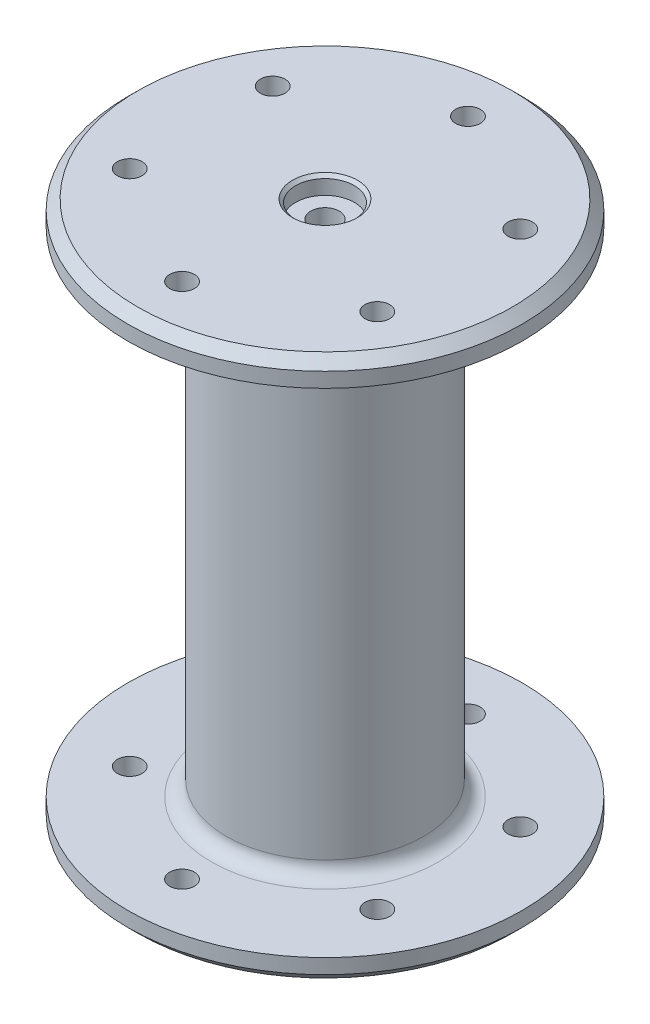
ISO-10303-21;
HEADER;
FILE_DESCRIPTION(('STEP AP214'),'2;1');
FILE_NAME('part.step','',(''),(''),'','','');
FILE_SCHEMA(('AUTOMOTIVE_DESIGN { 1 0 10303 214 1 1 1 1 }'));
ENDSEC;
DATA;
#1=APPLICATION_CONTEXT('core data for automotive mechanical design processes');
#2=APPLICATION_PROTOCOL_DEFINITION('international standard','automotive_design',2000,#1);
#3=PRODUCT_CONTEXT('',#1,'mechanical');
#4=PRODUCT('Part','Part','',(#3));
#5=PRODUCT_RELATED_PRODUCT_CATEGORY('part','',(#4));
#6=PRODUCT_DEFINITION_FORMATION('','',#4);
#7=PRODUCT_DEFINITION_CONTEXT('part definition',#1,'design');
#8=PRODUCT_DEFINITION('design','',#6,#7);
#9=PRODUCT_DEFINITION_SHAPE('','',#8);
#10=(LENGTH_UNIT() NAMED_UNIT(*) SI_UNIT(.MILLI.,.METRE.));
#11=(NAMED_UNIT(*) PLANE_ANGLE_UNIT() SI_UNIT($,.RADIAN.));
#12=(NAMED_UNIT(*) SI_UNIT($,.STERADIAN.) SOLID_ANGLE_UNIT());
#13=UNCERTAINTY_MEASURE_WITH_UNIT(LENGTH_MEASURE(1.E-05),#10,'distance_accuracy_value','');
#14=(GEOMETRIC_REPRESENTATION_CONTEXT(3) GLOBAL_UNCERTAINTY_ASSIGNED_CONTEXT((#13)) GLOBAL_UNIT_ASSIGNED_CONTEXT((#10,
#11,#12)) REPRESENTATION_CONTEXT('',''));
#15=CARTESIAN_POINT('',(0.,0.,0.));
#16=DIRECTION('',(0.,0.,1.));
#17=DIRECTION('',(1.,0.,0.));
#18=AXIS2_PLACEMENT_3D('',#15,#16,#17);
#19=CARTESIAN_POINT('',(0.,50.,0.));
#20=DIRECTION('',(0.,-1.,0.));
#21=DIRECTION('',(0.,0.,-1.));
#22=AXIS2_PLACEMENT_3D('',#19,#20,#21);
#23=CYLINDRICAL_SURFACE('',#22,20.);
#24=CARTESIAN_POINT('',(0.,-47.,0.));
#25=DIRECTION('',(0.,-1.,0.));
#26=DIRECTION('',(0.,0.,-1.));
#27=AXIS2_PLACEMENT_3D('',#24,#25,#26);
#28=CIRCLE('',#27,20.);
#29=CARTESIAN_POINT('',(0.,-47.,-20.));
#30=VERTEX_POINT('',#29);
#31=EDGE_CURVE('E45',#30,#30,#28,.F.);
#32=ORIENTED_EDGE('',*,*,#31,.T.);
#33=EDGE_LOOP('',(#32));
#34=FACE_BOUND('',#33,.T.);
#35=CARTESIAN_POINT('',(0.,47.,0.));
#36=DIRECTION('',(0.,1.,0.));
#37=DIRECTION('',(0.,0.,1.));
#38=AXIS2_PLACEMENT_3D('',#35,#36,#37);
#39=CIRCLE('',#38,20.);
#40=CARTESIAN_POINT('',(0.,47.,20.));
#41=VERTEX_POINT('',#40);
#42=EDGE_CURVE('E61',#41,#41,#39,.F.);
#43=ORIENTED_EDGE('',*,*,#42,.T.);
#44=EDGE_LOOP('',(#43));
#45=FACE_BOUND('',#44,.T.);
#46=ADVANCED_FACE('F37',(#34,#45),#23,.T.);
#47=CARTESIAN_POINT('',(0.,55.,0.));
#48=DIRECTION('',(0.,-1.,0.));
#49=DIRECTION('',(0.,0.,-1.));
#50=AXIS2_PLACEMENT_3D('',#47,#48,#49);
#51=CYLINDRICAL_SURFACE('',#50,40.);
#52=CARTESIAN_POINT('',(0.,53.,0.));
#53=DIRECTION('',(0.,1.,0.));
#54=DIRECTION('',(0.,0.,1.));
#55=AXIS2_PLACEMENT_3D('',#52,#53,#54);
#56=CIRCLE('',#55,40.);
#57=CARTESIAN_POINT('',(0.,53.,40.));
#58=VERTEX_POINT('',#57);
#59=EDGE_CURVE('E69',#58,#58,#56,.F.);
#60=ORIENTED_EDGE('',*,*,#59,.T.);
#61=EDGE_LOOP('',(#60));
#62=FACE_BOUND('',#61,.T.);
#63=CARTESIAN_POINT('',(0.,50.,0.));
#64=DIRECTION('',(0.,1.,0.));
#65=DIRECTION('',(0.,0.,1.));
#66=AXIS2_PLACEMENT_3D('',#63,#64,#65);
#67=CIRCLE('',#66,40.);
#68=CARTESIAN_POINT('',(0.,50.,40.));
#69=VERTEX_POINT('',#68);
#70=EDGE_CURVE('E96',#69,#69,#67,.T.);
#71=ORIENTED_EDGE('',*,*,#70,.T.);
#72=EDGE_LOOP('',(#71));
#73=FACE_BOUND('',#72,.T.);
#74=ADVANCED_FACE('F258',(#62,#73),#51,.T.);
#75=CARTESIAN_POINT('',(0.,55.,0.));
#76=DIRECTION('',(0.,1.,0.));
#77=DIRECTION('',(0.,0.,1.));
#78=AXIS2_PLACEMENT_3D('',#75,#76,#77);
#79=PLANE('',#78);
#80=CARTESIAN_POINT('',(0.,55.,0.));
#81=DIRECTION('',(0.,1.,0.));
#82=DIRECTION('',(0.,0.,1.));
#83=AXIS2_PLACEMENT_3D('',#80,#81,#82);
#84=CIRCLE('',#83,6.58876);
#85=CARTESIAN_POINT('',(0.,55.,6.58876));
#86=VERTEX_POINT('',#85);
#87=EDGE_CURVE('E141',#86,#86,#84,.T.);
#88=ORIENTED_EDGE('',*,*,#87,.F.);
#89=EDGE_LOOP('',(#88));
#90=FACE_BOUND('',#89,.T.);
#91=CARTESIAN_POINT('',(25.1147367097486,55.,-14.5000000000003));
#92=DIRECTION('',(0.,1.,0.));
#93=DIRECTION('',(-0.866025403784433,0.,0.50000000000001));
#94=AXIS2_PLACEMENT_3D('',#91,#92,#93);
#95=CIRCLE('',#94,2.5);
#96=CARTESIAN_POINT('',(22.9496732002875,55.,-13.2500000000003));
#97=VERTEX_POINT('',#96);
#98=EDGE_CURVE('E114',#97,#97,#95,.T.);
#99=ORIENTED_EDGE('',*,*,#98,.F.);
#100=EDGE_LOOP('',(#99));
#101=FACE_BOUND('',#100,.T.);
#102=CARTESIAN_POINT('',(25.1147367097489,55.,14.4999999999998));
#103=DIRECTION('',(0.,1.,0.));
#104=DIRECTION('',(-0.866025403784443,0.,-0.499999999999992));
#105=AXIS2_PLACEMENT_3D('',#102,#103,#104);
#106=CIRCLE('',#105,2.5);
#107=CARTESIAN_POINT('',(22.9496732002877,55.,13.2499999999998));
#108=VERTEX_POINT('',#107);
#109=EDGE_CURVE('E118',#108,#108,#106,.T.);
#110=ORIENTED_EDGE('',*,*,#109,.F.);
#111=EDGE_LOOP('',(#110));
#112=FACE_BOUND('',#111,.T.);
#113=CARTESIAN_POINT('',(0.,55.,29.));
#114=DIRECTION('',(0.,1.,0.));
#115=DIRECTION('',(0.,0.,-1.));
#116=AXIS2_PLACEMENT_3D('',#113,#114,#115);
#117=CIRCLE('',#116,2.5);
#118=CARTESIAN_POINT('',(0.,55.,26.5));
#119=VERTEX_POINT('',#118);
#120=EDGE_CURVE('E123',#119,#119,#117,.T.);
#121=ORIENTED_EDGE('',*,*,#120,.F.);
#122=EDGE_LOOP('',(#121));
#123=FACE_BOUND('',#122,.T.);
#124=CARTESIAN_POINT('',(-25.1147367097487,55.,14.5000000000001));
#125=DIRECTION('',(0.,1.,0.));
#126=DIRECTION('',(0.866025403784436,0.,-0.500000000000004));
#127=AXIS2_PLACEMENT_3D('',#124,#125,#126);
#128=CIRCLE('',#127,2.5);
#129=CARTESIAN_POINT('',(-22.9496732002876,55.,13.2500000000001));
#130=VERTEX_POINT('',#129);
#131=EDGE_CURVE('E113',#130,#130,#128,.T.);
#132=ORIENTED_EDGE('',*,*,#131,.F.);
#133=EDGE_LOOP('',(#132));
#134=FACE_BOUND('',#133,.T.);
#135=CARTESIAN_POINT('',(-25.1147367097488,55.,-14.4999999999999));
#136=DIRECTION('',(0.,1.,0.));
#137=DIRECTION('',(0.86602540378444,0.,0.499999999999998));
#138=AXIS2_PLACEMENT_3D('',#135,#136,#137);
#139=CIRCLE('',#138,2.5);
#140=CARTESIAN_POINT('',(-22.9496732002877,55.,-13.2499999999999));
#141=VERTEX_POINT('',#140);
#142=EDGE_CURVE('E91',#141,#141,#139,.T.);
#143=ORIENTED_EDGE('',*,*,#142,.F.);
#144=EDGE_LOOP('',(#143));
#145=FACE_BOUND('',#144,.T.);
#146=CARTESIAN_POINT('',(0.,55.,-29.));
#147=DIRECTION('',(0.,1.,0.));
#148=DIRECTION('',(0.,0.,1.));
#149=AXIS2_PLACEMENT_3D('',#146,#147,#148);
#150=CIRCLE('',#149,2.5);
#151=CARTESIAN_POINT('',(0.,55.,-26.5));
#152=VERTEX_POINT('',#151);
#153=EDGE_CURVE('E74',#152,#152,#150,.T.);
#154=ORIENTED_EDGE('',*,*,#153,.F.);
#155=EDGE_LOOP('',(#154));
#156=FACE_BOUND('',#155,.T.);
#157=CARTESIAN_POINT('',(0.,55.,0.));
#158=DIRECTION('',(0.,1.,0.));
#159=DIRECTION('',(0.,0.,1.));
#160=AXIS2_PLACEMENT_3D('',#157,#158,#159);
#161=CIRCLE('',#160,38.);
#162=CARTESIAN_POINT('',(0.,55.,38.));
#163=VERTEX_POINT('',#162);
#164=EDGE_CURVE('E100',#163,#163,#161,.T.);
#165=ORIENTED_EDGE('',*,*,#164,.T.);
#166=EDGE_LOOP('',(#165));
#167=FACE_BOUND('',#166,.T.);
#168=ADVANCED_FACE('F263',(#90,#101,#112,#123,#134,#145,#156,#167),#79,.T.);
#169=CARTESIAN_POINT('',(0.,50.,0.));
#170=DIRECTION('',(0.,1.,0.));
#171=DIRECTION('',(0.,0.,1.));
#172=AXIS2_PLACEMENT_3D('',#169,#170,#171);
#173=PLANE('',#172);
#174=CARTESIAN_POINT('',(0.,50.,0.));
#175=DIRECTION('',(0.,1.,0.));
#176=DIRECTION('',(0.,0.,1.));
#177=AXIS2_PLACEMENT_3D('',#174,#175,#176);
#178=CIRCLE('',#177,23.);
#179=CARTESIAN_POINT('',(0.,50.,23.));
#180=VERTEX_POINT('',#179);
#181=EDGE_CURVE('E65',#180,#180,#178,.T.);
#182=ORIENTED_EDGE('',*,*,#181,.T.);
#183=EDGE_LOOP('',(#182));
#184=FACE_BOUND('',#183,.T.);
#185=CARTESIAN_POINT('',(25.1147367097486,50.,-14.5000000000003));
#186=DIRECTION('',(0.,1.,0.));
#187=DIRECTION('',(0.,0.,1.));
#188=AXIS2_PLACEMENT_3D('',#185,#186,#187);
#189=CIRCLE('',#188,2.5);
#190=CARTESIAN_POINT('',(25.1147367097486,50.,-12.0000000000003));
#191=VERTEX_POINT('',#190);
#192=EDGE_CURVE('E70',#191,#191,#189,.T.);
#193=ORIENTED_EDGE('',*,*,#192,.T.);
#194=EDGE_LOOP('',(#193));
#195=FACE_BOUND('',#194,.T.);
#196=CARTESIAN_POINT('',(25.1147367097489,50.,14.4999999999998));
#197=DIRECTION('',(0.,1.,0.));
#198=DIRECTION('',(0.,0.,1.));
#199=AXIS2_PLACEMENT_3D('',#196,#197,#198);
#200=CIRCLE('',#199,2.5);
#201=CARTESIAN_POINT('',(25.1147367097489,50.,16.9999999999998));
#202=VERTEX_POINT('',#201);
#203=EDGE_CURVE('E75',#202,#202,#200,.T.);
#204=ORIENTED_EDGE('',*,*,#203,.T.);
#205=EDGE_LOOP('',(#204));
#206=FACE_BOUND('',#205,.T.);
#207=CARTESIAN_POINT('',(0.,50.,29.));
#208=DIRECTION('',(0.,1.,0.));
#209=DIRECTION('',(0.,0.,1.));
#210=AXIS2_PLACEMENT_3D('',#207,#208,#209);
#211=CIRCLE('',#210,2.5);
#212=CARTESIAN_POINT('',(0.,50.,31.5));
#213=VERTEX_POINT('',#212);
#214=EDGE_CURVE('E79',#213,#213,#211,.T.);
#215=ORIENTED_EDGE('',*,*,#214,.T.);
#216=EDGE_LOOP('',(#215));
#217=FACE_BOUND('',#216,.T.);
#218=CARTESIAN_POINT('',(-25.1147367097487,50.,14.5000000000001));
#219=DIRECTION('',(0.,1.,0.));
#220=DIRECTION('',(0.,0.,1.));
#221=AXIS2_PLACEMENT_3D('',#218,#219,#220);
#222=CIRCLE('',#221,2.5);
#223=CARTESIAN_POINT('',(-25.1147367097487,50.,17.0000000000001));
#224=VERTEX_POINT('',#223);
#225=EDGE_CURVE('E83',#224,#224,#222,.T.);
#226=ORIENTED_EDGE('',*,*,#225,.T.);
#227=EDGE_LOOP('',(#226));
#228=FACE_BOUND('',#227,.T.);
#229=CARTESIAN_POINT('',(-25.1147367097488,50.,-14.4999999999999));
#230=DIRECTION('',(0.,1.,0.));
#231=DIRECTION('',(0.,0.,1.));
#232=AXIS2_PLACEMENT_3D('',#229,#230,#231);
#233=CIRCLE('',#232,2.5);
#234=CARTESIAN_POINT('',(-25.1147367097488,50.,-11.9999999999999));
#235=VERTEX_POINT('',#234);
#236=EDGE_CURVE('E87',#235,#235,#233,.T.);
#237=ORIENTED_EDGE('',*,*,#236,.T.);
#238=EDGE_LOOP('',(#237));
#239=FACE_BOUND('',#238,.T.);
#240=CARTESIAN_POINT('',(0.,50.,-29.));
#241=DIRECTION('',(0.,1.,0.));
#242=DIRECTION('',(0.,0.,1.));
#243=AXIS2_PLACEMENT_3D('',#240,#241,#242);
#244=CIRCLE('',#243,2.5);
#245=CARTESIAN_POINT('',(0.,50.,-26.5));
#246=VERTEX_POINT('',#245);
#247=EDGE_CURVE('E92',#246,#246,#244,.T.);
#248=ORIENTED_EDGE('',*,*,#247,.T.);
#249=EDGE_LOOP('',(#248));
#250=FACE_BOUND('',#249,.T.);
#251=ORIENTED_EDGE('',*,*,#70,.F.);
#252=EDGE_LOOP('',(#251));
#253=FACE_BOUND('',#252,.T.);
#254=ADVANCED_FACE('F273',(#184,#195,#206,#217,#228,#239,#250,#253),#173,.F.);
#255=CARTESIAN_POINT('',(0.,55.,0.));
#256=DIRECTION('',(0.,-1.,0.));
#257=DIRECTION('',(0.,0.,-1.));
#258=AXIS2_PLACEMENT_3D('',#255,#256,#257);
#259=CONICAL_SURFACE('',#258,38.,0.78539816339744);
#260=ORIENTED_EDGE('',*,*,#59,.F.);
#261=EDGE_LOOP('',(#260));
#262=FACE_BOUND('',#261,.T.);
#263=ORIENTED_EDGE('',*,*,#164,.F.);
#264=EDGE_LOOP('',(#263));
#265=FACE_BOUND('',#264,.T.);
#266=ADVANCED_FACE('F269',(#262,#265),#259,.T.);
#267=CARTESIAN_POINT('',(0.,-50.,-29.));
#268=DIRECTION('',(0.,1.,0.));
#269=DIRECTION('',(0.,0.,1.));
#270=AXIS2_PLACEMENT_3D('',#267,#268,#269);
#271=CYLINDRICAL_SURFACE('',#270,2.5);
#272=ORIENTED_EDGE('',*,*,#153,.T.);
#273=EDGE_LOOP('',(#272));
#274=FACE_BOUND('',#273,.T.);
#275=ORIENTED_EDGE('',*,*,#247,.F.);
#276=EDGE_LOOP('',(#275));
#277=FACE_BOUND('',#276,.T.);
#278=ADVANCED_FACE('F272',(#274,#277),#271,.F.);
#279=CARTESIAN_POINT('',(-25.1147367097488,-50.,-14.4999999999999));
#280=DIRECTION('',(0.,1.,0.));
#281=DIRECTION('',(0.,0.,1.));
#282=AXIS2_PLACEMENT_3D('',#279,#280,#281);
#283=CYLINDRICAL_SURFACE('',#282,2.5);
#284=ORIENTED_EDGE('',*,*,#142,.T.);
#285=EDGE_LOOP('',(#284));
#286=FACE_BOUND('',#285,.T.);
#287=ORIENTED_EDGE('',*,*,#236,.F.);
#288=EDGE_LOOP('',(#287));
#289=FACE_BOUND('',#288,.T.);
#290=ADVANCED_FACE('F312',(#286,#289),#283,.F.);
#291=CARTESIAN_POINT('',(-25.1147367097487,-50.,14.5000000000001));
#292=DIRECTION('',(0.,1.,0.));
#293=DIRECTION('',(0.,0.,1.));
#294=AXIS2_PLACEMENT_3D('',#291,#292,#293);
#295=CYLINDRICAL_SURFACE('',#294,2.5);
#296=ORIENTED_EDGE('',*,*,#131,.T.);
#297=EDGE_LOOP('',(#296));
#298=FACE_BOUND('',#297,.T.);
#299=ORIENTED_EDGE('',*,*,#225,.F.);
#300=EDGE_LOOP('',(#299));
#301=FACE_BOUND('',#300,.T.);
#302=ADVANCED_FACE('F318',(#298,#301),#295,.F.);
#303=CARTESIAN_POINT('',(0.,-50.,29.));
#304=DIRECTION('',(0.,1.,0.));
#305=DIRECTION('',(0.,0.,1.));
#306=AXIS2_PLACEMENT_3D('',#303,#304,#305);
#307=CYLINDRICAL_SURFACE('',#306,2.5);
#308=ORIENTED_EDGE('',*,*,#120,.T.);
#309=EDGE_LOOP('',(#308));
#310=FACE_BOUND('',#309,.T.);
#311=ORIENTED_EDGE('',*,*,#214,.F.);
#312=EDGE_LOOP('',(#311));
#313=FACE_BOUND('',#312,.T.);
#314=ADVANCED_FACE('F346',(#310,#313),#307,.F.);
#315=CARTESIAN_POINT('',(25.1147367097489,-50.,14.4999999999998));
#316=DIRECTION('',(0.,1.,0.));
#317=DIRECTION('',(0.,0.,1.));
#318=AXIS2_PLACEMENT_3D('',#315,#316,#317);
#319=CYLINDRICAL_SURFACE('',#318,2.5);
#320=ORIENTED_EDGE('',*,*,#109,.T.);
#321=EDGE_LOOP('',(#320));
#322=FACE_BOUND('',#321,.T.);
#323=ORIENTED_EDGE('',*,*,#203,.F.);
#324=EDGE_LOOP('',(#323));
#325=FACE_BOUND('',#324,.T.);
#326=ADVANCED_FACE('F287',(#322,#325),#319,.F.);
#327=CARTESIAN_POINT('',(25.1147367097486,-50.,-14.5000000000003));
#328=DIRECTION('',(0.,1.,0.));
#329=DIRECTION('',(0.,0.,1.));
#330=AXIS2_PLACEMENT_3D('',#327,#328,#329);
#331=CYLINDRICAL_SURFACE('',#330,2.5);
#332=ORIENTED_EDGE('',*,*,#98,.T.);
#333=EDGE_LOOP('',(#332));
#334=FACE_BOUND('',#333,.T.);
#335=ORIENTED_EDGE('',*,*,#192,.F.);
#336=EDGE_LOOP('',(#335));
#337=FACE_BOUND('',#336,.T.);
#338=ADVANCED_FACE('F278',(#334,#337),#331,.F.);
#339=CARTESIAN_POINT('',(0.,47.,0.));
#340=DIRECTION('',(0.,1.,0.));
#341=DIRECTION('',(0.,0.,1.));
#342=AXIS2_PLACEMENT_3D('',#339,#340,#341);
#343=TOROIDAL_SURFACE('',#342,23.,3.);
#344=ORIENTED_EDGE('',*,*,#42,.F.);
#345=EDGE_LOOP('',(#344));
#346=FACE_BOUND('',#345,.T.);
#347=ORIENTED_EDGE('',*,*,#181,.F.);
#348=EDGE_LOOP('',(#347));
#349=FACE_BOUND('',#348,.T.);
#350=ADVANCED_FACE('F275',(#346,#349),#343,.F.);
#351=CARTESIAN_POINT('',(0.,55.,0.));
#352=DIRECTION('',(0.,1.,0.));
#353=DIRECTION('',(0.,0.,1.));
#354=AXIS2_PLACEMENT_3D('',#351,#352,#353);
#355=CYLINDRICAL_SURFACE('',#354,2.89559999999999);
#356=CARTESIAN_POINT('',(0.,51.4186,0.));
#357=DIRECTION('',(0.,1.,0.));
#358=DIRECTION('',(0.,0.,1.));
#359=AXIS2_PLACEMENT_3D('',#356,#357,#358);
#360=CIRCLE('',#359,2.8956);
#361=CARTESIAN_POINT('',(0.,51.4186,2.8956));
#362=VERTEX_POINT('',#361);
#363=EDGE_CURVE('E119',#362,#362,#360,.T.);
#364=ORIENTED_EDGE('',*,*,#363,.T.);
#365=EDGE_LOOP('',(#364));
#366=FACE_BOUND('',#365,.T.);
#367=CARTESIAN_POINT('',(0.,-51.4186,0.));
#368=DIRECTION('',(0.,-1.,0.));
#369=DIRECTION('',(0.,0.,-1.));
#370=AXIS2_PLACEMENT_3D('',#367,#368,#369);
#371=CIRCLE('',#370,2.8956);
#372=CARTESIAN_POINT('',(0.,-51.4186,-2.8956));
#373=VERTEX_POINT('',#372);
#374=EDGE_CURVE('E197',#373,#373,#371,.T.);
#375=ORIENTED_EDGE('',*,*,#374,.T.);
#376=EDGE_LOOP('',(#375));
#377=FACE_BOUND('',#376,.T.);
#378=ADVANCED_FACE('F277',(#366,#377),#355,.F.);
#379=CARTESIAN_POINT('',(5.95376,51.4186,0.));
#380=DIRECTION('',(0.,-1.,0.));
#381=DIRECTION('',(0.,0.,-1.));
#382=AXIS2_PLACEMENT_3D('',#379,#380,#381);
#383=PLANE('',#382);
#384=ORIENTED_EDGE('',*,*,#363,.F.);
#385=EDGE_LOOP('',(#384));
#386=FACE_BOUND('',#385,.T.);
#387=CARTESIAN_POINT('',(0.,51.4186,0.));
#388=DIRECTION('',(0.,1.,0.));
#389=DIRECTION('',(0.,0.,1.));
#390=AXIS2_PLACEMENT_3D('',#387,#388,#389);
#391=CIRCLE('',#390,5.95376);
#392=CARTESIAN_POINT('',(0.,51.4186,5.95376));
#393=VERTEX_POINT('',#392);
#394=EDGE_CURVE('E133',#393,#393,#391,.T.);
#395=ORIENTED_EDGE('',*,*,#394,.T.);
#396=EDGE_LOOP('',(#395));
#397=FACE_BOUND('',#396,.T.);
#398=ADVANCED_FACE('F284',(#386,#397),#383,.F.);
#399=CARTESIAN_POINT('',(0.,55.,0.));
#400=DIRECTION('',(0.,1.,0.));
#401=DIRECTION('',(0.,0.,1.));
#402=AXIS2_PLACEMENT_3D('',#399,#400,#401);
#403=CYLINDRICAL_SURFACE('',#402,5.95376);
#404=ORIENTED_EDGE('',*,*,#394,.F.);
#405=EDGE_LOOP('',(#404));
#406=FACE_BOUND('',#405,.T.);
#407=CARTESIAN_POINT('',(0.,54.365,0.));
#408=DIRECTION('',(0.,1.,0.));
#409=DIRECTION('',(0.,0.,1.));
#410=AXIS2_PLACEMENT_3D('',#407,#408,#409);
#411=CIRCLE('',#410,5.95376);
#412=CARTESIAN_POINT('',(0.,54.365,5.95376));
#413=VERTEX_POINT('',#412);
#414=EDGE_CURVE('E137',#413,#413,#411,.T.);
#415=ORIENTED_EDGE('',*,*,#414,.T.);
#416=EDGE_LOOP('',(#415));
#417=FACE_BOUND('',#416,.T.);
#418=ADVANCED_FACE('F253',(#406,#417),#403,.F.);
#419=CARTESIAN_POINT('',(0.,55.,0.));
#420=DIRECTION('',(0.,1.,0.));
#421=DIRECTION('',(0.,0.,1.));
#422=AXIS2_PLACEMENT_3D('',#419,#420,#421);
#423=CONICAL_SURFACE('',#422,6.58876,0.785398163397446);
#424=ORIENTED_EDGE('',*,*,#414,.F.);
#425=EDGE_LOOP('',(#424));
#426=FACE_BOUND('',#425,.T.);
#427=ORIENTED_EDGE('',*,*,#87,.T.);
#428=EDGE_LOOP('',(#427));
#429=FACE_BOUND('',#428,.T.);
#430=ADVANCED_FACE('F248',(#426,#429),#423,.F.);
#431=CARTESIAN_POINT('',(0.,-50.,0.));
#432=DIRECTION('',(0.,-1.,0.));
#433=DIRECTION('',(0.,0.,1.));
#434=AXIS2_PLACEMENT_3D('',#431,#432,#433);
#435=PLANE('',#434);
#436=CARTESIAN_POINT('',(0.,-50.,0.));
#437=DIRECTION('',(0.,-1.,0.));
#438=DIRECTION('',(0.,0.,-1.));
#439=AXIS2_PLACEMENT_3D('',#436,#437,#438);
#440=CIRCLE('',#439,23.);
#441=CARTESIAN_POINT('',(0.,-50.,-23.));
#442=VERTEX_POINT('',#441);
#443=EDGE_CURVE('E10',#442,#442,#440,.T.);
#444=ORIENTED_EDGE('',*,*,#443,.T.);
#445=EDGE_LOOP('',(#444));
#446=FACE_BOUND('',#445,.T.);
#447=CARTESIAN_POINT('',(25.1147367097486,-50.,-14.5000000000003));
#448=DIRECTION('',(0.,-1.,0.));
#449=DIRECTION('',(0.,0.,-1.));
#450=AXIS2_PLACEMENT_3D('',#447,#448,#449);
#451=CIRCLE('',#450,2.5);
#452=CARTESIAN_POINT('',(25.1147367097486,-50.,-17.0000000000003));
#453=VERTEX_POINT('',#452);
#454=EDGE_CURVE('E157',#453,#453,#451,.F.);
#455=ORIENTED_EDGE('',*,*,#454,.F.);
#456=EDGE_LOOP('',(#455));
#457=FACE_BOUND('',#456,.T.);
#458=CARTESIAN_POINT('',(25.1147367097489,-50.,14.4999999999998));
#459=DIRECTION('',(0.,-1.,0.));
#460=DIRECTION('',(0.,0.,-1.));
#461=AXIS2_PLACEMENT_3D('',#458,#459,#460);
#462=CIRCLE('',#461,2.5);
#463=CARTESIAN_POINT('',(25.1147367097489,-50.,11.9999999999998));
#464=VERTEX_POINT('',#463);
#465=EDGE_CURVE('E161',#464,#464,#462,.F.);
#466=ORIENTED_EDGE('',*,*,#465,.F.);
#467=EDGE_LOOP('',(#466));
#468=FACE_BOUND('',#467,.T.);
#469=CARTESIAN_POINT('',(0.,-50.,29.));
#470=DIRECTION('',(0.,-1.,0.));
#471=DIRECTION('',(0.,0.,-1.));
#472=AXIS2_PLACEMENT_3D('',#469,#470,#471);
#473=CIRCLE('',#472,2.5);
#474=CARTESIAN_POINT('',(0.,-50.,26.5));
#475=VERTEX_POINT('',#474);
#476=EDGE_CURVE('E165',#475,#475,#473,.F.);
#477=ORIENTED_EDGE('',*,*,#476,.F.);
#478=EDGE_LOOP('',(#477));
#479=FACE_BOUND('',#478,.T.);
#480=CARTESIAN_POINT('',(-25.1147367097487,-50.,14.5000000000001));
#481=DIRECTION('',(0.,-1.,0.));
#482=DIRECTION('',(0.,0.,-1.));
#483=AXIS2_PLACEMENT_3D('',#480,#481,#482);
#484=CIRCLE('',#483,2.5);
#485=CARTESIAN_POINT('',(-25.1147367097487,-50.,12.0000000000001));
#486=VERTEX_POINT('',#485);
#487=EDGE_CURVE('E169',#486,#486,#484,.F.);
#488=ORIENTED_EDGE('',*,*,#487,.F.);
#489=EDGE_LOOP('',(#488));
#490=FACE_BOUND('',#489,.T.);
#491=CARTESIAN_POINT('',(-25.1147367097488,-50.,-14.4999999999999));
#492=DIRECTION('',(0.,-1.,0.));
#493=DIRECTION('',(0.,0.,-1.));
#494=AXIS2_PLACEMENT_3D('',#491,#492,#493);
#495=CIRCLE('',#494,2.5);
#496=CARTESIAN_POINT('',(-25.1147367097488,-50.,-17.));
#497=VERTEX_POINT('',#496);
#498=EDGE_CURVE('E173',#497,#497,#495,.F.);
#499=ORIENTED_EDGE('',*,*,#498,.F.);
#500=EDGE_LOOP('',(#499));
#501=FACE_BOUND('',#500,.T.);
#502=CARTESIAN_POINT('',(0.,-50.,-29.));
#503=DIRECTION('',(0.,-1.,0.));
#504=DIRECTION('',(0.,0.,-1.));
#505=AXIS2_PLACEMENT_3D('',#502,#503,#504);
#506=CIRCLE('',#505,2.5);
#507=CARTESIAN_POINT('',(0.,-50.,-31.5));
#508=VERTEX_POINT('',#507);
#509=EDGE_CURVE('E149',#508,#508,#506,.F.);
#510=ORIENTED_EDGE('',*,*,#509,.F.);
#511=EDGE_LOOP('',(#510));
#512=FACE_BOUND('',#511,.T.);
#513=CARTESIAN_POINT('',(0.,-50.,0.));
#514=DIRECTION('',(0.,1.,0.));
#515=DIRECTION('',(0.,0.,1.));
#516=AXIS2_PLACEMENT_3D('',#513,#514,#515);
#517=CIRCLE('',#516,40.);
#518=CARTESIAN_POINT('',(0.,-50.,40.));
#519=VERTEX_POINT('',#518);
#520=EDGE_CURVE('E145',#519,#519,#517,.T.);
#521=ORIENTED_EDGE('',*,*,#520,.T.);
#522=EDGE_LOOP('',(#521));
#523=FACE_BOUND('',#522,.T.);
#524=ADVANCED_FACE('F220',(#446,#457,#468,#479,#490,#501,#512,#523),#435,.F.);
#525=CARTESIAN_POINT('',(0.,-55.,0.));
#526=DIRECTION('',(0.,-1.,0.));
#527=DIRECTION('',(0.,0.,1.));
#528=AXIS2_PLACEMENT_3D('',#525,#526,#527);
#529=PLANE('',#528);
#530=CARTESIAN_POINT('',(0.,-55.,0.));
#531=DIRECTION('',(0.,-1.,0.));
#532=DIRECTION('',(0.,0.,-1.));
#533=AXIS2_PLACEMENT_3D('',#530,#531,#532);
#534=CIRCLE('',#533,6.58876);
#535=CARTESIAN_POINT('',(0.,-55.,-6.58876));
#536=VERTEX_POINT('',#535);
#537=EDGE_CURVE('E209',#536,#536,#534,.T.);
#538=ORIENTED_EDGE('',*,*,#537,.F.);
#539=EDGE_LOOP('',(#538));
#540=FACE_BOUND('',#539,.T.);
#541=CARTESIAN_POINT('',(25.1147367097486,-55.,-14.5000000000003));
#542=DIRECTION('',(0.,1.,0.));
#543=DIRECTION('',(-0.866025403784433,0.,0.50000000000001));
#544=AXIS2_PLACEMENT_3D('',#541,#542,#543);
#545=CIRCLE('',#544,2.5);
#546=CARTESIAN_POINT('',(22.9496732002875,-55.,-13.2500000000003));
#547=VERTEX_POINT('',#546);
#548=EDGE_CURVE('E183',#547,#547,#545,.T.);
#549=ORIENTED_EDGE('',*,*,#548,.T.);
#550=EDGE_LOOP('',(#549));
#551=FACE_BOUND('',#550,.T.);
#552=CARTESIAN_POINT('',(25.1147367097489,-55.,14.4999999999998));
#553=DIRECTION('',(0.,1.,0.));
#554=DIRECTION('',(-0.866025403784443,0.,-0.499999999999992));
#555=AXIS2_PLACEMENT_3D('',#552,#553,#554);
#556=CIRCLE('',#555,2.5);
#557=CARTESIAN_POINT('',(22.9496732002877,-55.,13.2499999999998));
#558=VERTEX_POINT('',#557);
#559=EDGE_CURVE('E178',#558,#558,#556,.T.);
#560=ORIENTED_EDGE('',*,*,#559,.T.);
#561=EDGE_LOOP('',(#560));
#562=FACE_BOUND('',#561,.T.);
#563=CARTESIAN_POINT('',(0.,-55.,29.));
#564=DIRECTION('',(0.,1.,0.));
#565=DIRECTION('',(0.,0.,-1.));
#566=AXIS2_PLACEMENT_3D('',#563,#564,#565);
#567=CIRCLE('',#566,2.5);
#568=CARTESIAN_POINT('',(0.,-55.,26.5));
#569=VERTEX_POINT('',#568);
#570=EDGE_CURVE('E182',#569,#569,#567,.T.);
#571=ORIENTED_EDGE('',*,*,#570,.T.);
#572=EDGE_LOOP('',(#571));
#573=FACE_BOUND('',#572,.T.);
#574=CARTESIAN_POINT('',(-25.1147367097487,-55.,14.5000000000001));
#575=DIRECTION('',(0.,1.,0.));
#576=DIRECTION('',(0.866025403784436,0.,-0.500000000000004));
#577=AXIS2_PLACEMENT_3D('',#574,#575,#576);
#578=CIRCLE('',#577,2.5);
#579=CARTESIAN_POINT('',(-22.9496732002876,-55.,13.2500000000001));
#580=VERTEX_POINT('',#579);
#581=EDGE_CURVE('E187',#580,#580,#578,.T.);
#582=ORIENTED_EDGE('',*,*,#581,.T.);
#583=EDGE_LOOP('',(#582));
#584=FACE_BOUND('',#583,.T.);
#585=CARTESIAN_POINT('',(-25.1147367097488,-55.,-14.4999999999999));
#586=DIRECTION('',(0.,1.,0.));
#587=DIRECTION('',(0.86602540378444,0.,0.499999999999998));
#588=AXIS2_PLACEMENT_3D('',#585,#586,#587);
#589=CIRCLE('',#588,2.5);
#590=CARTESIAN_POINT('',(-22.9496732002877,-55.,-13.2499999999999));
#591=VERTEX_POINT('',#590);
#592=EDGE_CURVE('E177',#591,#591,#589,.T.);
#593=ORIENTED_EDGE('',*,*,#592,.T.);
#594=EDGE_LOOP('',(#593));
#595=FACE_BOUND('',#594,.T.);
#596=CARTESIAN_POINT('',(0.,-55.,-29.));
#597=DIRECTION('',(0.,1.,0.));
#598=DIRECTION('',(0.,0.,1.));
#599=AXIS2_PLACEMENT_3D('',#596,#597,#598);
#600=CIRCLE('',#599,2.5);
#601=CARTESIAN_POINT('',(0.,-55.,-26.5));
#602=VERTEX_POINT('',#601);
#603=EDGE_CURVE('E153',#602,#602,#600,.T.);
#604=ORIENTED_EDGE('',*,*,#603,.T.);
#605=EDGE_LOOP('',(#604));
#606=FACE_BOUND('',#605,.T.);
#607=CARTESIAN_POINT('',(0.,-55.,0.));
#608=DIRECTION('',(0.,-1.,0.));
#609=DIRECTION('',(0.,0.,-1.));
#610=AXIS2_PLACEMENT_3D('',#607,#608,#609);
#611=CIRCLE('',#610,38.);
#612=CARTESIAN_POINT('',(0.,-55.,-38.));
#613=VERTEX_POINT('',#612);
#614=EDGE_CURVE('E50',#613,#613,#611,.T.);
#615=ORIENTED_EDGE('',*,*,#614,.T.);
#616=EDGE_LOOP('',(#615));
#617=FACE_BOUND('',#616,.T.);
#618=ADVANCED_FACE('F216',(#540,#551,#562,#573,#584,#595,#606,#617),#529,.T.);
#619=CARTESIAN_POINT('',(0.,-55.,0.));
#620=DIRECTION('',(0.,1.,0.));
#621=DIRECTION('',(0.,0.,1.));
#622=AXIS2_PLACEMENT_3D('',#619,#620,#621);
#623=CYLINDRICAL_SURFACE('',#622,40.);
#624=CARTESIAN_POINT('',(0.,-53.,0.));
#625=DIRECTION('',(0.,-1.,0.));
#626=DIRECTION('',(0.,0.,-1.));
#627=AXIS2_PLACEMENT_3D('',#624,#625,#626);
#628=CIRCLE('',#627,40.);
#629=CARTESIAN_POINT('',(0.,-53.,-40.));
#630=VERTEX_POINT('',#629);
#631=EDGE_CURVE('E55',#630,#630,#628,.F.);
#632=ORIENTED_EDGE('',*,*,#631,.T.);
#633=EDGE_LOOP('',(#632));
#634=FACE_BOUND('',#633,.T.);
#635=ORIENTED_EDGE('',*,*,#520,.F.);
#636=EDGE_LOOP('',(#635));
#637=FACE_BOUND('',#636,.T.);
#638=ADVANCED_FACE('F219',(#634,#637),#623,.T.);
#639=CARTESIAN_POINT('',(0.,-53.,0.));
#640=DIRECTION('',(0.,1.,0.));
#641=DIRECTION('',(0.,0.,1.));
#642=AXIS2_PLACEMENT_3D('',#639,#640,#641);
#643=CONICAL_SURFACE('',#642,40.,0.785398163397443);
#644=ORIENTED_EDGE('',*,*,#614,.F.);
#645=EDGE_LOOP('',(#644));
#646=FACE_BOUND('',#645,.T.);
#647=ORIENTED_EDGE('',*,*,#631,.F.);
#648=EDGE_LOOP('',(#647));
#649=FACE_BOUND('',#648,.T.);
#650=ADVANCED_FACE('F236',(#646,#649),#643,.T.);
#651=CARTESIAN_POINT('',(0.,55.,-29.));
#652=DIRECTION('',(0.,-1.,0.));
#653=DIRECTION('',(0.,0.,-1.));
#654=AXIS2_PLACEMENT_3D('',#651,#652,#653);
#655=CYLINDRICAL_SURFACE('',#654,2.5);
#656=ORIENTED_EDGE('',*,*,#603,.F.);
#657=EDGE_LOOP('',(#656));
#658=FACE_BOUND('',#657,.T.);
#659=ORIENTED_EDGE('',*,*,#509,.T.);
#660=EDGE_LOOP('',(#659));
#661=FACE_BOUND('',#660,.T.);
#662=ADVANCED_FACE('F239',(#658,#661),#655,.F.);
#663=CARTESIAN_POINT('',(-25.1147367097488,55.,-14.4999999999999));
#664=DIRECTION('',(0.,-1.,0.));
#665=DIRECTION('',(0.,0.,-1.));
#666=AXIS2_PLACEMENT_3D('',#663,#664,#665);
#667=CYLINDRICAL_SURFACE('',#666,2.5);
#668=ORIENTED_EDGE('',*,*,#592,.F.);
#669=EDGE_LOOP('',(#668));
#670=FACE_BOUND('',#669,.T.);
#671=ORIENTED_EDGE('',*,*,#498,.T.);
#672=EDGE_LOOP('',(#671));
#673=FACE_BOUND('',#672,.T.);
#674=ADVANCED_FACE('F449',(#670,#673),#667,.F.);
#675=CARTESIAN_POINT('',(-25.1147367097487,55.,14.5000000000001));
#676=DIRECTION('',(0.,-1.,0.));
#677=DIRECTION('',(0.,0.,-1.));
#678=AXIS2_PLACEMENT_3D('',#675,#676,#677);
#679=CYLINDRICAL_SURFACE('',#678,2.5);
#680=ORIENTED_EDGE('',*,*,#581,.F.);
#681=EDGE_LOOP('',(#680));
#682=FACE_BOUND('',#681,.T.);
#683=ORIENTED_EDGE('',*,*,#487,.T.);
#684=EDGE_LOOP('',(#683));
#685=FACE_BOUND('',#684,.T.);
#686=ADVANCED_FACE('F459',(#682,#685),#679,.F.);
#687=CARTESIAN_POINT('',(0.,55.,29.));
#688=DIRECTION('',(0.,-1.,0.));
#689=DIRECTION('',(0.,0.,-1.));
#690=AXIS2_PLACEMENT_3D('',#687,#688,#689);
#691=CYLINDRICAL_SURFACE('',#690,2.5);
#692=ORIENTED_EDGE('',*,*,#570,.F.);
#693=EDGE_LOOP('',(#692));
#694=FACE_BOUND('',#693,.T.);
#695=ORIENTED_EDGE('',*,*,#476,.T.);
#696=EDGE_LOOP('',(#695));
#697=FACE_BOUND('',#696,.T.);
#698=ADVANCED_FACE('F469',(#694,#697),#691,.F.);
#699=CARTESIAN_POINT('',(25.1147367097489,55.,14.4999999999998));
#700=DIRECTION('',(0.,-1.,0.));
#701=DIRECTION('',(0.,0.,-1.));
#702=AXIS2_PLACEMENT_3D('',#699,#700,#701);
#703=CYLINDRICAL_SURFACE('',#702,2.5);
#704=ORIENTED_EDGE('',*,*,#559,.F.);
#705=EDGE_LOOP('',(#704));
#706=FACE_BOUND('',#705,.T.);
#707=ORIENTED_EDGE('',*,*,#465,.T.);
#708=EDGE_LOOP('',(#707));
#709=FACE_BOUND('',#708,.T.);
#710=ADVANCED_FACE('F479',(#706,#709),#703,.F.);
#711=CARTESIAN_POINT('',(25.1147367097486,55.,-14.5000000000003));
#712=DIRECTION('',(0.,-1.,0.));
#713=DIRECTION('',(0.,0.,-1.));
#714=AXIS2_PLACEMENT_3D('',#711,#712,#713);
#715=CYLINDRICAL_SURFACE('',#714,2.5);
#716=ORIENTED_EDGE('',*,*,#548,.F.);
#717=EDGE_LOOP('',(#716));
#718=FACE_BOUND('',#717,.T.);
#719=ORIENTED_EDGE('',*,*,#454,.T.);
#720=EDGE_LOOP('',(#719));
#721=FACE_BOUND('',#720,.T.);
#722=ADVANCED_FACE('F489',(#718,#721),#715,.F.);
#723=CARTESIAN_POINT('',(0.,-47.,0.));
#724=DIRECTION('',(0.,-1.,0.));
#725=DIRECTION('',(0.,0.,-1.));
#726=AXIS2_PLACEMENT_3D('',#723,#724,#725);
#727=TOROIDAL_SURFACE('',#726,23.,3.);
#728=ORIENTED_EDGE('',*,*,#443,.F.);
#729=EDGE_LOOP('',(#728));
#730=FACE_BOUND('',#729,.T.);
#731=ORIENTED_EDGE('',*,*,#31,.F.);
#732=EDGE_LOOP('',(#731));
#733=FACE_BOUND('',#732,.T.);
#734=ADVANCED_FACE('F39',(#730,#733),#727,.F.);
#735=CARTESIAN_POINT('',(5.95376,-51.4186,0.));
#736=DIRECTION('',(0.,1.,0.));
#737=DIRECTION('',(0.,0.,1.));
#738=AXIS2_PLACEMENT_3D('',#735,#736,#737);
#739=PLANE('',#738);
#740=ORIENTED_EDGE('',*,*,#374,.F.);
#741=EDGE_LOOP('',(#740));
#742=FACE_BOUND('',#741,.T.);
#743=CARTESIAN_POINT('',(0.,-51.4186,0.));
#744=DIRECTION('',(0.,-1.,0.));
#745=DIRECTION('',(0.,0.,-1.));
#746=AXIS2_PLACEMENT_3D('',#743,#744,#745);
#747=CIRCLE('',#746,5.95376);
#748=CARTESIAN_POINT('',(0.,-51.4186,-5.95376));
#749=VERTEX_POINT('',#748);
#750=EDGE_CURVE('E201',#749,#749,#747,.T.);
#751=ORIENTED_EDGE('',*,*,#750,.T.);
#752=EDGE_LOOP('',(#751));
#753=FACE_BOUND('',#752,.T.);
#754=ADVANCED_FACE('F507',(#742,#753),#739,.F.);
#755=CARTESIAN_POINT('',(0.,-55.,0.));
#756=DIRECTION('',(0.,-1.,0.));
#757=DIRECTION('',(0.,0.,-1.));
#758=AXIS2_PLACEMENT_3D('',#755,#756,#757);
#759=CYLINDRICAL_SURFACE('',#758,5.95376);
#760=ORIENTED_EDGE('',*,*,#750,.F.);
#761=EDGE_LOOP('',(#760));
#762=FACE_BOUND('',#761,.T.);
#763=CARTESIAN_POINT('',(0.,-54.365,0.));
#764=DIRECTION('',(0.,-1.,0.));
#765=DIRECTION('',(0.,0.,-1.));
#766=AXIS2_PLACEMENT_3D('',#763,#764,#765);
#767=CIRCLE('',#766,5.95376);
#768=CARTESIAN_POINT('',(0.,-54.365,-5.95376));
#769=VERTEX_POINT('',#768);
#770=EDGE_CURVE('E205',#769,#769,#767,.T.);
#771=ORIENTED_EDGE('',*,*,#770,.T.);
#772=EDGE_LOOP('',(#771));
#773=FACE_BOUND('',#772,.T.);
#774=ADVANCED_FACE('F515',(#762,#773),#759,.F.);
#775=CARTESIAN_POINT('',(0.,-55.,0.));
#776=DIRECTION('',(0.,-1.,0.));
#777=DIRECTION('',(0.,0.,-1.));
#778=AXIS2_PLACEMENT_3D('',#775,#776,#777);
#779=CONICAL_SURFACE('',#778,6.58876,0.785398163397446);
#780=ORIENTED_EDGE('',*,*,#770,.F.);
#781=EDGE_LOOP('',(#780));
#782=FACE_BOUND('',#781,.T.);
#783=ORIENTED_EDGE('',*,*,#537,.T.);
#784=EDGE_LOOP('',(#783));
#785=FACE_BOUND('',#784,.T.);
#786=ADVANCED_FACE('F214',(#782,#785),#779,.F.);
#787=CLOSED_SHELL('',(#46,#74,#168,#254,#266,#278,#290,#302,#314,#326,#338,#350,#378,#398,#418,
#430,#524,#618,#638,#650,#662,#674,#686,#698,#710,#722,#734,#754,#774,#786));
#788=MANIFOLD_SOLID_BREP('B2',#787);
#789=ADVANCED_BREP_SHAPE_REPRESENTATION('',(#18,#788),#14);
#790=SHAPE_DEFINITION_REPRESENTATION(#9,#789);
ENDSEC;
END-ISO-10303-21;
